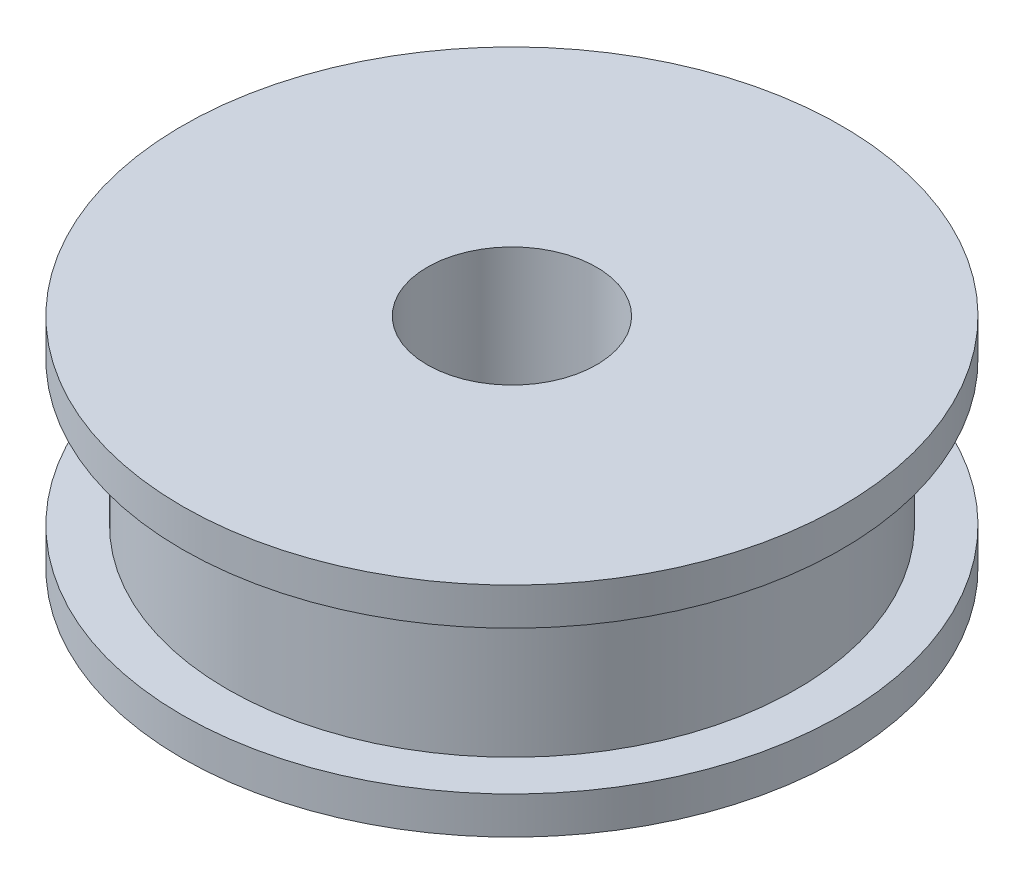
ISO-10303-21;
HEADER;
FILE_DESCRIPTION(('STEP AP214'),'2;1');
FILE_NAME('part.step','',(''),(''),'','','');
FILE_SCHEMA(('AUTOMOTIVE_DESIGN { 1 0 10303 214 1 1 1 1 }'));
ENDSEC;
DATA;
#1=APPLICATION_CONTEXT('core data for automotive mechanical design processes');
#2=APPLICATION_PROTOCOL_DEFINITION('international standard','automotive_design',2000,#1);
#3=PRODUCT_CONTEXT('',#1,'mechanical');
#4=PRODUCT('Part','Part','',(#3));
#5=PRODUCT_RELATED_PRODUCT_CATEGORY('part','',(#4));
#6=PRODUCT_DEFINITION_FORMATION('','',#4);
#7=PRODUCT_DEFINITION_CONTEXT('part definition',#1,'design');
#8=PRODUCT_DEFINITION('design','',#6,#7);
#9=PRODUCT_DEFINITION_SHAPE('','',#8);
#10=(LENGTH_UNIT() NAMED_UNIT(*) SI_UNIT(.MILLI.,.METRE.));
#11=(NAMED_UNIT(*) PLANE_ANGLE_UNIT() SI_UNIT($,.RADIAN.));
#12=(NAMED_UNIT(*) SI_UNIT($,.STERADIAN.) SOLID_ANGLE_UNIT());
#13=UNCERTAINTY_MEASURE_WITH_UNIT(LENGTH_MEASURE(1.E-05),#10,'distance_accuracy_value','');
#14=(GEOMETRIC_REPRESENTATION_CONTEXT(3) GLOBAL_UNCERTAINTY_ASSIGNED_CONTEXT((#13)) GLOBAL_UNIT_ASSIGNED_CONTEXT((#10,
#11,#12)) REPRESENTATION_CONTEXT('',''));
#15=CARTESIAN_POINT('',(0.,0.,0.));
#16=DIRECTION('',(0.,0.,1.));
#17=DIRECTION('',(1.,0.,0.));
#18=AXIS2_PLACEMENT_3D('',#15,#16,#17);
#19=CARTESIAN_POINT('',(0.,1.3462,0.));
#20=DIRECTION('',(0.,1.,0.));
#21=DIRECTION('',(0.,0.,1.));
#22=AXIS2_PLACEMENT_3D('',#19,#20,#21);
#23=PLANE('',#22);
#24=CARTESIAN_POINT('',(0.,1.3462,0.));
#25=DIRECTION('',(0.,1.,0.));
#26=DIRECTION('',(0.,0.,1.));
#27=AXIS2_PLACEMENT_3D('',#24,#25,#26);
#28=CIRCLE('',#27,11.86815);
#29=CARTESIAN_POINT('',(0.,1.3462,11.86815));
#30=VERTEX_POINT('',#29);
#31=EDGE_CURVE('E10',#30,#30,#28,.T.);
#32=ORIENTED_EDGE('',*,*,#31,.T.);
#33=EDGE_LOOP('',(#32));
#34=FACE_BOUND('',#33,.T.);
#35=CARTESIAN_POINT('',(0.,1.3462,0.));
#36=DIRECTION('',(0.,1.,0.));
#37=DIRECTION('',(0.,0.,1.));
#38=AXIS2_PLACEMENT_3D('',#35,#36,#37);
#39=CIRCLE('',#38,10.2489);
#40=CARTESIAN_POINT('',(0.,1.3462,10.2489));
#41=VERTEX_POINT('',#40);
#42=EDGE_CURVE('E43',#41,#41,#39,.T.);
#43=ORIENTED_EDGE('',*,*,#42,.F.);
#44=EDGE_LOOP('',(#43));
#45=FACE_BOUND('',#44,.T.);
#46=ADVANCED_FACE('F30',(#34,#45),#23,.T.);
#47=CARTESIAN_POINT('',(0.,1.3462,0.));
#48=DIRECTION('',(0.,-1.,0.));
#49=DIRECTION('',(0.,0.,-1.));
#50=AXIS2_PLACEMENT_3D('',#47,#48,#49);
#51=CYLINDRICAL_SURFACE('',#50,11.86815);
#52=ORIENTED_EDGE('',*,*,#31,.F.);
#53=EDGE_LOOP('',(#52));
#54=FACE_BOUND('',#53,.T.);
#55=CARTESIAN_POINT('',(0.,0.,0.));
#56=DIRECTION('',(0.,1.,0.));
#57=DIRECTION('',(0.,0.,1.));
#58=AXIS2_PLACEMENT_3D('',#55,#56,#57);
#59=CIRCLE('',#58,11.86815);
#60=CARTESIAN_POINT('',(0.,0.,11.86815));
#61=VERTEX_POINT('',#60);
#62=EDGE_CURVE('E34',#61,#61,#59,.T.);
#63=ORIENTED_EDGE('',*,*,#62,.T.);
#64=EDGE_LOOP('',(#63));
#65=FACE_BOUND('',#64,.T.);
#66=ADVANCED_FACE('F32',(#54,#65),#51,.T.);
#67=CARTESIAN_POINT('',(0.,0.,0.));
#68=DIRECTION('',(0.,1.,0.));
#69=DIRECTION('',(0.,0.,1.));
#70=AXIS2_PLACEMENT_3D('',#67,#68,#69);
#71=PLANE('',#70);
#72=CARTESIAN_POINT('',(0.,0.,0.));
#73=DIRECTION('',(0.,1.,0.));
#74=DIRECTION('',(0.,0.,1.));
#75=AXIS2_PLACEMENT_3D('',#72,#73,#74);
#76=CIRCLE('',#75,3.048);
#77=CARTESIAN_POINT('',(0.,0.,3.048));
#78=VERTEX_POINT('',#77);
#79=EDGE_CURVE('E52',#78,#78,#76,.T.);
#80=ORIENTED_EDGE('',*,*,#79,.T.);
#81=EDGE_LOOP('',(#80));
#82=FACE_BOUND('',#81,.T.);
#83=ORIENTED_EDGE('',*,*,#62,.F.);
#84=EDGE_LOOP('',(#83));
#85=FACE_BOUND('',#84,.T.);
#86=ADVANCED_FACE('F61',(#82,#85),#71,.F.);
#87=CARTESIAN_POINT('',(0.,6.5151,0.));
#88=DIRECTION('',(0.,-1.,0.));
#89=DIRECTION('',(0.,0.,-1.));
#90=AXIS2_PLACEMENT_3D('',#87,#88,#89);
#91=CYLINDRICAL_SURFACE('',#90,10.2489);
#92=CARTESIAN_POINT('',(0.,6.5151,0.));
#93=DIRECTION('',(0.,1.,0.));
#94=DIRECTION('',(0.,0.,1.));
#95=AXIS2_PLACEMENT_3D('',#92,#93,#94);
#96=CIRCLE('',#95,10.2489);
#97=CARTESIAN_POINT('',(0.,6.5151,10.2489));
#98=VERTEX_POINT('',#97);
#99=EDGE_CURVE('E41',#98,#98,#96,.T.);
#100=ORIENTED_EDGE('',*,*,#99,.F.);
#101=EDGE_LOOP('',(#100));
#102=FACE_BOUND('',#101,.T.);
#103=ORIENTED_EDGE('',*,*,#42,.T.);
#104=EDGE_LOOP('',(#103));
#105=FACE_BOUND('',#104,.T.);
#106=ADVANCED_FACE('F85',(#102,#105),#91,.T.);
#107=CARTESIAN_POINT('',(0.,6.5151,0.));
#108=DIRECTION('',(0.,1.,0.));
#109=DIRECTION('',(0.,0.,1.));
#110=AXIS2_PLACEMENT_3D('',#107,#108,#109);
#111=PLANE('',#110);
#112=CARTESIAN_POINT('',(0.,6.5151,0.));
#113=DIRECTION('',(0.,1.,0.));
#114=DIRECTION('',(0.,0.,1.));
#115=AXIS2_PLACEMENT_3D('',#112,#113,#114);
#116=CIRCLE('',#115,11.86815);
#117=CARTESIAN_POINT('',(0.,6.5151,11.86815));
#118=VERTEX_POINT('',#117);
#119=EDGE_CURVE('E49',#118,#118,#116,.T.);
#120=ORIENTED_EDGE('',*,*,#119,.F.);
#121=EDGE_LOOP('',(#120));
#122=FACE_BOUND('',#121,.T.);
#123=ORIENTED_EDGE('',*,*,#99,.T.);
#124=EDGE_LOOP('',(#123));
#125=FACE_BOUND('',#124,.T.);
#126=ADVANCED_FACE('F79',(#122,#125),#111,.F.);
#127=CARTESIAN_POINT('',(0.,7.8613,0.));
#128=DIRECTION('',(0.,-1.,0.));
#129=DIRECTION('',(0.,0.,-1.));
#130=AXIS2_PLACEMENT_3D('',#127,#128,#129);
#131=CYLINDRICAL_SURFACE('',#130,11.86815);
#132=CARTESIAN_POINT('',(0.,7.8613,0.));
#133=DIRECTION('',(0.,1.,0.));
#134=DIRECTION('',(0.,0.,1.));
#135=AXIS2_PLACEMENT_3D('',#132,#133,#134);
#136=CIRCLE('',#135,11.86815);
#137=CARTESIAN_POINT('',(0.,7.8613,11.86815));
#138=VERTEX_POINT('',#137);
#139=EDGE_CURVE('E46',#138,#138,#136,.T.);
#140=ORIENTED_EDGE('',*,*,#139,.F.);
#141=EDGE_LOOP('',(#140));
#142=FACE_BOUND('',#141,.T.);
#143=ORIENTED_EDGE('',*,*,#119,.T.);
#144=EDGE_LOOP('',(#143));
#145=FACE_BOUND('',#144,.T.);
#146=ADVANCED_FACE('F73',(#142,#145),#131,.T.);
#147=CARTESIAN_POINT('',(0.,7.8613,0.));
#148=DIRECTION('',(0.,1.,0.));
#149=DIRECTION('',(0.,0.,1.));
#150=AXIS2_PLACEMENT_3D('',#147,#148,#149);
#151=PLANE('',#150);
#152=CARTESIAN_POINT('',(0.,7.8613,0.));
#153=DIRECTION('',(0.,1.,0.));
#154=DIRECTION('',(0.,0.,1.));
#155=AXIS2_PLACEMENT_3D('',#152,#153,#154);
#156=CIRCLE('',#155,3.048);
#157=CARTESIAN_POINT('',(0.,7.8613,3.048));
#158=VERTEX_POINT('',#157);
#159=EDGE_CURVE('E55',#158,#158,#156,.T.);
#160=ORIENTED_EDGE('',*,*,#159,.F.);
#161=EDGE_LOOP('',(#160));
#162=FACE_BOUND('',#161,.T.);
#163=ORIENTED_EDGE('',*,*,#139,.T.);
#164=EDGE_LOOP('',(#163));
#165=FACE_BOUND('',#164,.T.);
#166=ADVANCED_FACE('F67',(#162,#165),#151,.T.);
#167=CARTESIAN_POINT('',(0.,0.,0.));
#168=DIRECTION('',(0.,1.,0.));
#169=DIRECTION('',(0.,0.,1.));
#170=AXIS2_PLACEMENT_3D('',#167,#168,#169);
#171=CYLINDRICAL_SURFACE('',#170,3.048);
#172=ORIENTED_EDGE('',*,*,#79,.F.);
#173=EDGE_LOOP('',(#172));
#174=FACE_BOUND('',#173,.T.);
#175=ORIENTED_EDGE('',*,*,#159,.T.);
#176=EDGE_LOOP('',(#175));
#177=FACE_BOUND('',#176,.T.);
#178=ADVANCED_FACE('F64',(#174,#177),#171,.F.);
#179=CLOSED_SHELL('',(#46,#66,#86,#106,#126,#146,#166,#178));
#180=MANIFOLD_SOLID_BREP('B2',#179);
#181=ADVANCED_BREP_SHAPE_REPRESENTATION('',(#18,#180),#14);
#182=SHAPE_DEFINITION_REPRESENTATION(#9,#181);
ENDSEC;
END-ISO-10303-21;
